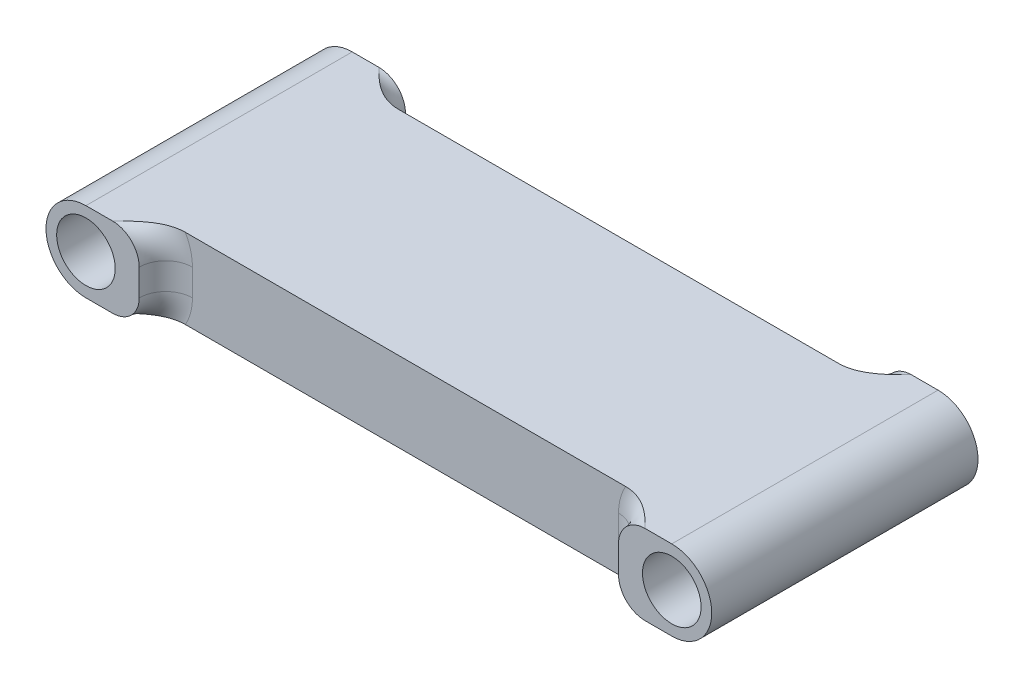
ISO-10303-21;
HEADER;
FILE_DESCRIPTION(('STEP AP214'),'2;1');
FILE_NAME('part.step','',(''),(''),'','','');
FILE_SCHEMA(('AUTOMOTIVE_DESIGN { 1 0 10303 214 1 1 1 1 }'));
ENDSEC;
DATA;
#1=APPLICATION_CONTEXT('core data for automotive mechanical design processes');
#2=APPLICATION_PROTOCOL_DEFINITION('international standard','automotive_design',2000,#1);
#3=PRODUCT_CONTEXT('',#1,'mechanical');
#4=PRODUCT('Part','Part','',(#3));
#5=PRODUCT_RELATED_PRODUCT_CATEGORY('part','',(#4));
#6=PRODUCT_DEFINITION_FORMATION('','',#4);
#7=PRODUCT_DEFINITION_CONTEXT('part definition',#1,'design');
#8=PRODUCT_DEFINITION('design','',#6,#7);
#9=PRODUCT_DEFINITION_SHAPE('','',#8);
#10=(LENGTH_UNIT() NAMED_UNIT(*) SI_UNIT(.MILLI.,.METRE.));
#11=(NAMED_UNIT(*) PLANE_ANGLE_UNIT() SI_UNIT($,.RADIAN.));
#12=(NAMED_UNIT(*) SI_UNIT($,.STERADIAN.) SOLID_ANGLE_UNIT());
#13=UNCERTAINTY_MEASURE_WITH_UNIT(LENGTH_MEASURE(1.E-05),#10,'distance_accuracy_value','');
#14=(GEOMETRIC_REPRESENTATION_CONTEXT(3) GLOBAL_UNCERTAINTY_ASSIGNED_CONTEXT((#13)) GLOBAL_UNIT_ASSIGNED_CONTEXT((#10,
#11,#12)) REPRESENTATION_CONTEXT('',''));
#15=CARTESIAN_POINT('',(0.,0.,0.));
#16=DIRECTION('',(0.,0.,1.));
#17=DIRECTION('',(1.,0.,0.));
#18=AXIS2_PLACEMENT_3D('',#15,#16,#17);
#19=CARTESIAN_POINT('',(55.,0.,25.));
#20=DIRECTION('',(0.,0.,1.));
#21=DIRECTION('',(1.,0.,0.));
#22=AXIS2_PLACEMENT_3D('',#19,#20,#21);
#23=PLANE('',#22);
#24=CARTESIAN_POINT('',(55.,0.,25.));
#25=DIRECTION('',(0.,0.,1.));
#26=DIRECTION('',(1.,0.,0.));
#27=AXIS2_PLACEMENT_3D('',#24,#25,#26);
#28=CIRCLE('',#27,5.5);
#29=CARTESIAN_POINT('',(60.5,0.,25.));
#30=VERTEX_POINT('',#29);
#31=EDGE_CURVE('E451',#30,#30,#28,.T.);
#32=ORIENTED_EDGE('',*,*,#31,.F.);
#33=EDGE_LOOP('',(#32));
#34=FACE_BOUND('',#33,.T.);
#35=DIRECTION('',(0.,1.,0.));
#36=VECTOR('',#35,1.);
#37=CARTESIAN_POINT('',(45.,-7.50000000000002,25.));
#38=LINE('',#37,#36);
#39=CARTESIAN_POINT('',(45.,-2.49999999999998,25.));
#40=VERTEX_POINT('',#39);
#41=CARTESIAN_POINT('',(45.,2.50000000000001,25.));
#42=VERTEX_POINT('',#41);
#43=EDGE_CURVE('E432',#40,#42,#38,.T.);
#44=ORIENTED_EDGE('',*,*,#43,.F.);
#45=CARTESIAN_POINT('',(50.,-2.49999999999998,25.));
#46=DIRECTION('',(0.,0.,1.));
#47=DIRECTION('',(1.,0.,0.));
#48=AXIS2_PLACEMENT_3D('',#45,#46,#47);
#49=CIRCLE('',#48,5.);
#50=CARTESIAN_POINT('',(50.,-7.49999999999998,25.));
#51=VERTEX_POINT('',#50);
#52=EDGE_CURVE('E236',#40,#51,#49,.T.);
#53=ORIENTED_EDGE('',*,*,#52,.T.);
#54=DIRECTION('',(1.,0.,0.));
#55=VECTOR('',#54,1.);
#56=CARTESIAN_POINT('',(55.,-7.49999999999998,25.));
#57=LINE('',#56,#55);
#58=CARTESIAN_POINT('',(55.,-7.49999999999998,25.));
#59=VERTEX_POINT('',#58);
#60=EDGE_CURVE('E202',#51,#59,#57,.T.);
#61=ORIENTED_EDGE('',*,*,#60,.T.);
#62=CARTESIAN_POINT('',(55.,0.,25.));
#63=DIRECTION('',(0.,0.,1.));
#64=DIRECTION('',(1.,0.,0.));
#65=AXIS2_PLACEMENT_3D('',#62,#63,#64);
#66=CIRCLE('',#65,7.5);
#67=CARTESIAN_POINT('',(55.,7.50000000000002,25.));
#68=VERTEX_POINT('',#67);
#69=EDGE_CURVE('E200',#59,#68,#66,.T.);
#70=ORIENTED_EDGE('',*,*,#69,.T.);
#71=DIRECTION('',(-1.,0.,0.));
#72=VECTOR('',#71,1.);
#73=CARTESIAN_POINT('',(55.,7.50000000000002,25.));
#74=LINE('',#73,#72);
#75=CARTESIAN_POINT('',(50.,7.50000000000002,25.));
#76=VERTEX_POINT('',#75);
#77=EDGE_CURVE('E183',#68,#76,#74,.T.);
#78=ORIENTED_EDGE('',*,*,#77,.T.);
#79=CARTESIAN_POINT('',(50.,2.50000000000002,25.));
#80=DIRECTION('',(0.,0.,1.));
#81=DIRECTION('',(1.,0.,0.));
#82=AXIS2_PLACEMENT_3D('',#79,#80,#81);
#83=CIRCLE('',#82,5.);
#84=EDGE_CURVE('E233',#76,#42,#83,.T.);
#85=ORIENTED_EDGE('',*,*,#84,.T.);
#86=EDGE_LOOP('',(#44,#53,#61,#70,#78,#85));
#87=FACE_BOUND('',#86,.T.);
#88=ADVANCED_FACE('F43',(#34,#87),#23,.T.);
#89=CARTESIAN_POINT('',(55.,0.,-25.));
#90=DIRECTION('',(0.,0.,1.));
#91=DIRECTION('',(1.,0.,0.));
#92=AXIS2_PLACEMENT_3D('',#89,#90,#91);
#93=PLANE('',#92);
#94=CARTESIAN_POINT('',(55.,0.,-25.));
#95=DIRECTION('',(0.,0.,1.));
#96=DIRECTION('',(1.,0.,0.));
#97=AXIS2_PLACEMENT_3D('',#94,#95,#96);
#98=CIRCLE('',#97,5.5);
#99=CARTESIAN_POINT('',(60.5,0.,-25.));
#100=VERTEX_POINT('',#99);
#101=EDGE_CURVE('E450',#100,#100,#98,.T.);
#102=ORIENTED_EDGE('',*,*,#101,.T.);
#103=EDGE_LOOP('',(#102));
#104=FACE_BOUND('',#103,.T.);
#105=DIRECTION('',(1.,0.,0.));
#106=VECTOR('',#105,1.);
#107=CARTESIAN_POINT('',(55.,-7.49999999999998,-25.));
#108=LINE('',#107,#106);
#109=CARTESIAN_POINT('',(50.,-7.49999999999998,-25.));
#110=VERTEX_POINT('',#109);
#111=CARTESIAN_POINT('',(55.,-7.49999999999998,-25.));
#112=VERTEX_POINT('',#111);
#113=EDGE_CURVE('E483',#110,#112,#108,.T.);
#114=ORIENTED_EDGE('',*,*,#113,.F.);
#115=CARTESIAN_POINT('',(50.,-2.49999999999998,-25.));
#116=DIRECTION('',(0.,0.,1.));
#117=DIRECTION('',(1.,0.,0.));
#118=AXIS2_PLACEMENT_3D('',#115,#116,#117);
#119=CIRCLE('',#118,5.);
#120=CARTESIAN_POINT('',(45.,-2.49999999999998,-25.));
#121=VERTEX_POINT('',#120);
#122=EDGE_CURVE('E248',#110,#121,#119,.F.);
#123=ORIENTED_EDGE('',*,*,#122,.T.);
#124=DIRECTION('',(0.,1.,0.));
#125=VECTOR('',#124,1.);
#126=CARTESIAN_POINT('',(45.,-7.50000000000002,-25.));
#127=LINE('',#126,#125);
#128=CARTESIAN_POINT('',(45.,2.50000000000001,-25.));
#129=VERTEX_POINT('',#128);
#130=EDGE_CURVE('E517',#121,#129,#127,.T.);
#131=ORIENTED_EDGE('',*,*,#130,.T.);
#132=CARTESIAN_POINT('',(50.,2.50000000000002,-25.));
#133=DIRECTION('',(0.,0.,1.));
#134=DIRECTION('',(1.,0.,0.));
#135=AXIS2_PLACEMENT_3D('',#132,#133,#134);
#136=CIRCLE('',#135,5.);
#137=CARTESIAN_POINT('',(50.,7.50000000000002,-25.));
#138=VERTEX_POINT('',#137);
#139=EDGE_CURVE('E245',#129,#138,#136,.F.);
#140=ORIENTED_EDGE('',*,*,#139,.T.);
#141=DIRECTION('',(-1.,0.,0.));
#142=VECTOR('',#141,1.);
#143=CARTESIAN_POINT('',(55.,7.50000000000002,-25.));
#144=LINE('',#143,#142);
#145=CARTESIAN_POINT('',(55.,7.50000000000002,-25.));
#146=VERTEX_POINT('',#145);
#147=EDGE_CURVE('E476',#146,#138,#144,.T.);
#148=ORIENTED_EDGE('',*,*,#147,.F.);
#149=CARTESIAN_POINT('',(55.,0.,-25.));
#150=DIRECTION('',(0.,0.,1.));
#151=DIRECTION('',(1.,0.,0.));
#152=AXIS2_PLACEMENT_3D('',#149,#150,#151);
#153=CIRCLE('',#152,7.5);
#154=EDGE_CURVE('E212',#112,#146,#153,.T.);
#155=ORIENTED_EDGE('',*,*,#154,.F.);
#156=EDGE_LOOP('',(#114,#123,#131,#140,#148,#155));
#157=FACE_BOUND('',#156,.T.);
#158=ADVANCED_FACE('F559',(#104,#157),#93,.F.);
#159=CARTESIAN_POINT('',(-55.,0.,-25.));
#160=DIRECTION('',(0.,0.,1.));
#161=DIRECTION('',(1.,0.,0.));
#162=AXIS2_PLACEMENT_3D('',#159,#160,#161);
#163=CIRCLE('',#162,5.5);
#164=CARTESIAN_POINT('',(-49.5,0.,-25.));
#165=VERTEX_POINT('',#164);
#166=EDGE_CURVE('E455',#165,#165,#163,.T.);
#167=ORIENTED_EDGE('',*,*,#166,.T.);
#168=EDGE_LOOP('',(#167));
#169=FACE_BOUND('',#168,.T.);
#170=CARTESIAN_POINT('',(-50.,7.49999999999999,-25.));
#171=VERTEX_POINT('',#170);
#172=CARTESIAN_POINT('',(-55.,7.49999999999999,-25.));
#173=VERTEX_POINT('',#172);
#174=EDGE_CURVE('E475',#171,#173,#144,.T.);
#175=ORIENTED_EDGE('',*,*,#174,.F.);
#176=CARTESIAN_POINT('',(-50.,2.49999999999999,-25.));
#177=DIRECTION('',(0.,0.,1.));
#178=DIRECTION('',(1.,0.,0.));
#179=AXIS2_PLACEMENT_3D('',#176,#177,#178);
#180=CIRCLE('',#179,5.);
#181=CARTESIAN_POINT('',(-45.,2.49999999999999,-25.));
#182=VERTEX_POINT('',#181);
#183=EDGE_CURVE('E254',#171,#182,#180,.F.);
#184=ORIENTED_EDGE('',*,*,#183,.T.);
#185=DIRECTION('',(0.,1.,0.));
#186=VECTOR('',#185,1.);
#187=CARTESIAN_POINT('',(-45.,-7.50000000000004,-25.));
#188=LINE('',#187,#186);
#189=CARTESIAN_POINT('',(-45.,-2.50000000000001,-25.));
#190=VERTEX_POINT('',#189);
#191=EDGE_CURVE('E504',#190,#182,#188,.T.);
#192=ORIENTED_EDGE('',*,*,#191,.F.);
#193=CARTESIAN_POINT('',(-50.,-2.50000000000001,-25.));
#194=DIRECTION('',(0.,0.,1.));
#195=DIRECTION('',(1.,0.,0.));
#196=AXIS2_PLACEMENT_3D('',#193,#194,#195);
#197=CIRCLE('',#196,5.);
#198=CARTESIAN_POINT('',(-50.,-7.50000000000001,-25.));
#199=VERTEX_POINT('',#198);
#200=EDGE_CURVE('E251',#190,#199,#197,.F.);
#201=ORIENTED_EDGE('',*,*,#200,.T.);
#202=CARTESIAN_POINT('',(-55.,-7.50000000000001,-25.));
#203=VERTEX_POINT('',#202);
#204=EDGE_CURVE('E207',#203,#199,#108,.T.);
#205=ORIENTED_EDGE('',*,*,#204,.F.);
#206=CARTESIAN_POINT('',(-55.,0.,-25.));
#207=DIRECTION('',(0.,0.,1.));
#208=DIRECTION('',(1.,0.,0.));
#209=AXIS2_PLACEMENT_3D('',#206,#207,#208);
#210=CIRCLE('',#209,7.5);
#211=EDGE_CURVE('E479',#173,#203,#210,.T.);
#212=ORIENTED_EDGE('',*,*,#211,.F.);
#213=EDGE_LOOP('',(#175,#184,#192,#201,#205,#212));
#214=FACE_BOUND('',#213,.T.);
#215=ADVANCED_FACE('F501',(#169,#214),#93,.F.);
#216=CARTESIAN_POINT('',(55.,7.50000000000002,25.));
#217=DIRECTION('',(0.,-1.,0.));
#218=DIRECTION('',(1.,0.,0.));
#219=AXIS2_PLACEMENT_3D('',#216,#217,#218);
#220=PLANE('',#219);
#221=CARTESIAN_POINT('',(-50.,7.49999999999999,25.));
#222=VERTEX_POINT('',#221);
#223=CARTESIAN_POINT('',(-55.,7.49999999999999,25.));
#224=VERTEX_POINT('',#223);
#225=EDGE_CURVE('E197',#222,#224,#74,.T.);
#226=ORIENTED_EDGE('',*,*,#225,.F.);
#227=CARTESIAN_POINT('',(-41.3397459621556,7.5,20.));
#228=CARTESIAN_POINT('',(-41.5539842692324,7.5,19.9999703034739));
#229=CARTESIAN_POINT('',(-41.768097465597,7.49999999999999,20.0103223198115));
#230=CARTESIAN_POINT('',(-42.1941977522546,7.49999999999999,20.050367720903));
#231=CARTESIAN_POINT('',(-42.4061875803566,7.49999999999999,20.0800316721569));
#232=CARTESIAN_POINT('',(-42.8242924364531,7.49999999999999,20.1568219385643));
#233=CARTESIAN_POINT('',(-43.03044747217,7.49999999999999,20.2037335763176));
#234=CARTESIAN_POINT('',(-43.4385029560438,7.49999999999999,20.3135973669761));
#235=CARTESIAN_POINT('',(-43.6404013218539,7.49999999999999,20.3765571821013));
#236=CARTESIAN_POINT('',(-44.1132359176737,7.49999999999999,20.5431403705869));
#237=CARTESIAN_POINT('',(-44.3819191639897,7.49999999999999,20.6531782939246));
#238=CARTESIAN_POINT('',(-44.9084009542293,7.49999999999999,20.8966864157497));
#239=CARTESIAN_POINT('',(-45.1661961696543,7.49999999999999,21.0301637163094));
#240=CARTESIAN_POINT('',(-45.6717553078735,7.49999999999999,21.3174239745699));
#241=CARTESIAN_POINT('',(-45.9194654505235,7.49999999999999,21.4713008527283));
#242=CARTESIAN_POINT('',(-46.4040882068455,7.49999999999999,21.7953125127805));
#243=CARTESIAN_POINT('',(-46.6409958114063,7.49999999999999,21.9654547258867));
#244=CARTESIAN_POINT('',(-47.4334968335473,7.49999999999999,22.5687077761884));
#245=CARTESIAN_POINT('',(-47.9651805169322,7.49999999999999,23.032940684198));
#246=CARTESIAN_POINT('',(-48.9945791026282,7.49999999999999,23.9947603934727));
#247=CARTESIAN_POINT('',(-49.4923199370093,7.49999999999999,24.4923211431129));
#248=CARTESIAN_POINT('',(-49.9933333310541,7.49999999999999,24.9933333330424));
#249=CARTESIAN_POINT('',(-49.9966666643816,7.49999999999999,24.9966666663836));
#250=CARTESIAN_POINT('',(-50.,7.49999999999999,25.));
#251=B_SPLINE_CURVE_WITH_KNOTS('',3,(#227,#228,#229,#230,#231,#232,#233,#234,#235,#236,#237,
#238,#239,#240,#241,#242,#243,#244,#245,#246,#247,#248,#249,#250),.UNSPECIFIED.,.F.,.F.,(4,2,2,
2,2,2,2,2,2,2,2,4),(0.,0.642281703378409,1.28358678373059,1.91716595005307,2.55104818793522,
3.42069998684846,4.29061574416331,5.16468554626506,6.03915661439453,8.15226547096974,
10.2637414108498,10.2778835464735),.UNSPECIFIED.);
#252=CARTESIAN_POINT('',(-41.3397459621556,7.49999999999999,20.));
#253=VERTEX_POINT('',#252);
#254=EDGE_CURVE('E379',#222,#253,#251,.F.);
#255=ORIENTED_EDGE('',*,*,#254,.T.);
#256=DIRECTION('',(1.,0.,0.));
#257=VECTOR('',#256,1.);
#258=CARTESIAN_POINT('',(55.,7.50000000000002,20.));
#259=LINE('',#258,#257);
#260=CARTESIAN_POINT('',(41.3397459621556,7.50000000000002,20.));
#261=VERTEX_POINT('',#260);
#262=EDGE_CURVE('E232',#253,#261,#259,.T.);
#263=ORIENTED_EDGE('',*,*,#262,.T.);
#264=CARTESIAN_POINT('',(41.3397459621556,7.50000000000002,20.));
#265=CARTESIAN_POINT('',(41.5539842692325,7.50000000000002,19.9999703034739));
#266=CARTESIAN_POINT('',(41.7680974655974,7.50000000000002,20.0103223198115));
#267=CARTESIAN_POINT('',(42.1941977522552,7.50000000000002,20.0503677209031));
#268=CARTESIAN_POINT('',(42.4061875803574,7.50000000000002,20.080031672157));
#269=CARTESIAN_POINT('',(42.8242924364538,7.50000000000002,20.1568219385644));
#270=CARTESIAN_POINT('',(43.0304474721706,7.50000000000002,20.2037335763178));
#271=CARTESIAN_POINT('',(43.4385029560442,7.50000000000002,20.3135973669762));
#272=CARTESIAN_POINT('',(43.6404013218541,7.50000000000002,20.3765571821013));
#273=CARTESIAN_POINT('',(44.1132359176736,7.50000000000002,20.5431403705868));
#274=CARTESIAN_POINT('',(44.3819191639895,7.50000000000002,20.6531782939245));
#275=CARTESIAN_POINT('',(44.9084009542289,7.50000000000002,20.8966864157495));
#276=CARTESIAN_POINT('',(45.1661961696538,7.50000000000002,21.0301637163091));
#277=CARTESIAN_POINT('',(45.671755307873,7.50000000000002,21.3174239745696));
#278=CARTESIAN_POINT('',(45.9194654505231,7.50000000000002,21.4713008527281));
#279=CARTESIAN_POINT('',(46.4040882068454,7.50000000000002,21.7953125127803));
#280=CARTESIAN_POINT('',(46.6409958114064,7.50000000000002,21.9654547258865));
#281=CARTESIAN_POINT('',(47.433496833547,7.50000000000002,22.5687077761889));
#282=CARTESIAN_POINT('',(47.9651805169302,7.50000000000002,23.0329406842003));
#283=CARTESIAN_POINT('',(48.9945791026305,7.50000000000002,23.9947603934707));
#284=CARTESIAN_POINT('',(49.4923199370178,7.50000000000002,24.4923211431047));
#285=CARTESIAN_POINT('',(49.9933333310543,7.50000000000002,24.9933333330423));
#286=CARTESIAN_POINT('',(49.9966666643817,7.50000000000002,24.9966666663835));
#287=CARTESIAN_POINT('',(50.,7.50000000000002,25.));
#288=B_SPLINE_CURVE_WITH_KNOTS('',3,(#264,#265,#266,#267,#268,#269,#270,#271,#272,#273,#274,
#275,#276,#277,#278,#279,#280,#281,#282,#283,#284,#285,#286,#287),.UNSPECIFIED.,.F.,.F.,(4,2,2,
2,2,2,2,2,2,2,2,4),(0.,0.642281703378847,1.28358678373148,1.91716595005353,2.55104818793522,
3.42069998684809,4.29061574416262,5.16468554626477,6.03915661439455,8.15226547097013,
10.2637414108498,10.2778835464735),.UNSPECIFIED.);
#289=EDGE_CURVE('E11',#261,#76,#288,.T.);
#290=ORIENTED_EDGE('',*,*,#289,.T.);
#291=ORIENTED_EDGE('',*,*,#77,.F.);
#292=DIRECTION('',(0.,0.,-1.));
#293=VECTOR('',#292,1.);
#294=CARTESIAN_POINT('',(55.,7.50000000000002,25.));
#295=LINE('',#294,#293);
#296=EDGE_CURVE('E189',#68,#146,#295,.T.);
#297=ORIENTED_EDGE('',*,*,#296,.T.);
#298=ORIENTED_EDGE('',*,*,#147,.T.);
#299=CARTESIAN_POINT('',(41.3397459621556,7.50000000000002,-20.));
#300=CARTESIAN_POINT('',(41.5539842692325,7.50000000000002,-19.9999703034739));
#301=CARTESIAN_POINT('',(41.7680974655973,7.50000000000002,-20.0103223198115));
#302=CARTESIAN_POINT('',(42.1941977522551,7.50000000000002,-20.0503677209031));
#303=CARTESIAN_POINT('',(42.4061875803573,7.50000000000002,-20.080031672157));
#304=CARTESIAN_POINT('',(42.8242924364537,7.50000000000002,-20.1568219385644));
#305=CARTESIAN_POINT('',(43.0304474721705,7.50000000000002,-20.2037335763178));
#306=CARTESIAN_POINT('',(43.4385029560441,7.50000000000002,-20.3135973669762));
#307=CARTESIAN_POINT('',(43.640401321854,7.50000000000002,-20.3765571821014));
#308=CARTESIAN_POINT('',(44.1132359176736,7.50000000000002,-20.5431403705869));
#309=CARTESIAN_POINT('',(44.3819191639895,7.50000000000002,-20.6531782939245));
#310=CARTESIAN_POINT('',(44.9084009542289,7.50000000000002,-20.8966864157495));
#311=CARTESIAN_POINT('',(45.1661961696539,7.50000000000002,-21.0301637163092));
#312=CARTESIAN_POINT('',(45.6717553078731,7.50000000000002,-21.3174239745697));
#313=CARTESIAN_POINT('',(45.9194654505232,7.50000000000002,-21.4713008527282));
#314=CARTESIAN_POINT('',(46.4040882068454,7.50000000000002,-21.7953125127804));
#315=CARTESIAN_POINT('',(46.6409958114064,7.50000000000002,-21.9654547258866));
#316=CARTESIAN_POINT('',(47.4334968335471,7.50000000000002,-22.5687077761888));
#317=CARTESIAN_POINT('',(47.9651805169305,7.50000000000002,-23.0329406842));
#318=CARTESIAN_POINT('',(48.9945791026302,7.50000000000002,-23.994760393471));
#319=CARTESIAN_POINT('',(49.4923199370166,7.50000000000002,-24.4923211431059));
#320=CARTESIAN_POINT('',(49.9933333310543,7.50000000000002,-24.9933333330423));
#321=CARTESIAN_POINT('',(49.9966666643817,7.50000000000002,-24.9966666663836));
#322=CARTESIAN_POINT('',(50.,7.50000000000002,-25.));
#323=B_SPLINE_CURVE_WITH_KNOTS('',3,(#299,#300,#301,#302,#303,#304,#305,#306,#307,#308,#309,
#310,#311,#312,#313,#314,#315,#316,#317,#318,#319,#320,#321,#322),.UNSPECIFIED.,.F.,.F.,(4,2,2,
2,2,2,2,2,2,2,2,4),(0.,0.642281703378785,1.28358678373135,1.91716595005346,2.55104818793522,
3.42069998684815,4.29061574416273,5.16468554626482,6.03915661439454,8.15226547097009,
10.2637414108498,10.2778835464735),.UNSPECIFIED.);
#324=CARTESIAN_POINT('',(41.3397459621556,7.50000000000002,-20.));
#325=VERTEX_POINT('',#324);
#326=EDGE_CURVE('E303',#138,#325,#323,.F.);
#327=ORIENTED_EDGE('',*,*,#326,.T.);
#328=DIRECTION('',(1.,0.,0.));
#329=VECTOR('',#328,1.);
#330=CARTESIAN_POINT('',(55.,7.50000000000002,-20.));
#331=LINE('',#330,#329);
#332=CARTESIAN_POINT('',(-41.3397459621556,7.49999999999999,-20.));
#333=VERTEX_POINT('',#332);
#334=EDGE_CURVE('E437',#333,#325,#331,.T.);
#335=ORIENTED_EDGE('',*,*,#334,.F.);
#336=CARTESIAN_POINT('',(-41.3397459621556,7.5,-20.));
#337=CARTESIAN_POINT('',(-41.5539842692328,7.5,-19.9999703034739));
#338=CARTESIAN_POINT('',(-41.7680974655979,7.49999999999999,-20.0103223198115));
#339=CARTESIAN_POINT('',(-42.1941977522564,7.49999999999999,-20.0503677209032));
#340=CARTESIAN_POINT('',(-42.4061875803588,7.49999999999999,-20.0800316721572));
#341=CARTESIAN_POINT('',(-42.8242924364552,7.49999999999999,-20.1568219385647));
#342=CARTESIAN_POINT('',(-43.0304474721717,7.49999999999999,-20.2037335763181));
#343=CARTESIAN_POINT('',(-43.4385029560447,7.49999999999999,-20.3135973669764));
#344=CARTESIAN_POINT('',(-43.6404013218543,7.49999999999999,-20.3765571821014));
#345=CARTESIAN_POINT('',(-44.1132359176733,7.49999999999999,-20.5431403705868));
#346=CARTESIAN_POINT('',(-44.381919163989,7.49999999999999,-20.6531782939243));
#347=CARTESIAN_POINT('',(-44.908400954228,7.49999999999999,-20.8966864157491));
#348=CARTESIAN_POINT('',(-45.1661961696528,7.49999999999999,-21.0301637163086));
#349=CARTESIAN_POINT('',(-45.671755307872,7.49999999999999,-21.317423974569));
#350=CARTESIAN_POINT('',(-45.9194654505223,7.49999999999999,-21.4713008527277));
#351=CARTESIAN_POINT('',(-46.4040882068451,7.49999999999999,-21.79531251278));
#352=CARTESIAN_POINT('',(-46.6409958114065,7.49999999999999,-21.9654547258861));
#353=CARTESIAN_POINT('',(-47.4334968335465,7.49999999999999,-22.5687077761897));
#354=CARTESIAN_POINT('',(-47.9651805169262,7.49999999999998,-23.032940684205));
#355=CARTESIAN_POINT('',(-48.9945791026352,7.5,-23.9947603934667));
#356=CARTESIAN_POINT('',(-49.4923199370346,7.50000000000003,-24.4923211430882));
#357=CARTESIAN_POINT('',(-49.9933333310545,7.49999999999999,-24.9933333330421));
#358=CARTESIAN_POINT('',(-49.9966666643818,7.49999999999999,-24.9966666663834));
#359=CARTESIAN_POINT('',(-50.,7.49999999999999,-25.));
#360=B_SPLINE_CURVE_WITH_KNOTS('',3,(#336,#337,#338,#339,#340,#341,#342,#343,#344,#345,#346,
#347,#348,#349,#350,#351,#352,#353,#354,#355,#356,#357,#358,#359),.UNSPECIFIED.,.F.,.F.,(4,2,2,
2,2,2,2,2,2,2,2,4),(0.,0.642281703379697,1.28358678373324,1.91716595005442,2.55104818793522,
3.42069998684735,4.29061574416124,5.16468554626419,6.03915661439455,8.15226547097088,
10.2637414108497,10.2778835464735),.UNSPECIFIED.);
#361=EDGE_CURVE('E346',#333,#171,#360,.T.);
#362=ORIENTED_EDGE('',*,*,#361,.T.);
#363=ORIENTED_EDGE('',*,*,#174,.T.);
#364=DIRECTION('',(0.,0.,-1.));
#365=VECTOR('',#364,1.);
#366=CARTESIAN_POINT('',(-55.,7.49999999999999,25.));
#367=LINE('',#366,#365);
#368=EDGE_CURVE('E215',#224,#173,#367,.T.);
#369=ORIENTED_EDGE('',*,*,#368,.F.);
#370=EDGE_LOOP('',(#226,#255,#263,#290,#291,#297,#298,#327,#335,#362,#363,#369));
#371=FACE_BOUND('',#370,.T.);
#372=ADVANCED_FACE('F186',(#371),#220,.F.);
#373=CARTESIAN_POINT('',(55.,-7.49999999999998,25.));
#374=DIRECTION('',(0.,1.,0.));
#375=DIRECTION('',(-1.,0.,0.));
#376=AXIS2_PLACEMENT_3D('',#373,#374,#375);
#377=PLANE('',#376);
#378=ORIENTED_EDGE('',*,*,#60,.F.);
#379=CARTESIAN_POINT('',(41.3397459621557,-7.50000000000002,20.));
#380=CARTESIAN_POINT('',(41.5539842692325,-7.5,19.9999703034739));
#381=CARTESIAN_POINT('',(41.7680974655972,-7.49999999999999,20.0103223198115));
#382=CARTESIAN_POINT('',(42.1941977522549,-7.49999999999998,20.0503677209031));
#383=CARTESIAN_POINT('',(42.406187580357,-7.49999999999998,20.080031672157));
#384=CARTESIAN_POINT('',(42.8242924364534,-7.49999999999998,20.1568219385643));
#385=CARTESIAN_POINT('',(43.0304474721703,-7.49999999999998,20.2037335763177));
#386=CARTESIAN_POINT('',(43.438502956044,-7.49999999999998,20.3135973669762));
#387=CARTESIAN_POINT('',(43.640401321854,-7.49999999999998,20.3765571821013));
#388=CARTESIAN_POINT('',(44.1132359176737,-7.49999999999998,20.5431403705869));
#389=CARTESIAN_POINT('',(44.3819191639896,-7.49999999999998,20.6531782939245));
#390=CARTESIAN_POINT('',(44.9084009542292,-7.49999999999998,20.8966864157496));
#391=CARTESIAN_POINT('',(45.1661961696541,-7.49999999999998,21.0301637163093));
#392=CARTESIAN_POINT('',(45.6717553078733,-7.49999999999998,21.3174239745698));
#393=CARTESIAN_POINT('',(45.9194654505233,-7.49999999999998,21.4713008527282));
#394=CARTESIAN_POINT('',(46.4040882068455,-7.49999999999998,21.7953125127804));
#395=CARTESIAN_POINT('',(46.6409958114064,-7.49999999999998,21.9654547258867));
#396=CARTESIAN_POINT('',(47.4334968335472,-7.49999999999998,22.5687077761886));
#397=CARTESIAN_POINT('',(47.9651805169314,-7.49999999999998,23.032940684199));
#398=CARTESIAN_POINT('',(48.9945791026292,-7.49999999999998,23.9947603934718));
#399=CARTESIAN_POINT('',(49.4923199370131,-7.49999999999998,24.4923211431093));
#400=CARTESIAN_POINT('',(49.9933333310542,-7.49999999999998,24.9933333330423));
#401=CARTESIAN_POINT('',(49.9966666643817,-7.49999999999998,24.9966666663836));
#402=CARTESIAN_POINT('',(50.,-7.49999999999998,25.));
#403=B_SPLINE_CURVE_WITH_KNOTS('',3,(#379,#380,#381,#382,#383,#384,#385,#386,#387,#388,#389,
#390,#391,#392,#393,#394,#395,#396,#397,#398,#399,#400,#401,#402),.UNSPECIFIED.,.F.,.F.,(4,2,2,
2,2,2,2,2,2,2,2,4),(0.,0.642281703378597,1.28358678373098,1.91716595005326,2.55104818793522,
3.42069998684831,4.29061574416301,5.16468554626494,6.03915661439455,8.15226547096992,
10.2637414108497,10.2778835464735),.UNSPECIFIED.);
#404=CARTESIAN_POINT('',(41.3397459621557,-7.50000000000002,20.));
#405=VERTEX_POINT('',#404);
#406=EDGE_CURVE('E54',#51,#405,#403,.F.);
#407=ORIENTED_EDGE('',*,*,#406,.T.);
#408=DIRECTION('',(-1.,0.,0.));
#409=VECTOR('',#408,1.);
#410=CARTESIAN_POINT('',(0.,-7.50000000000003,20.));
#411=LINE('',#410,#409);
#412=CARTESIAN_POINT('',(-41.3397459621556,-7.50000000000004,20.));
#413=VERTEX_POINT('',#412);
#414=EDGE_CURVE('E525',#405,#413,#411,.T.);
#415=ORIENTED_EDGE('',*,*,#414,.T.);
#416=CARTESIAN_POINT('',(-41.3397459621556,-7.50000000000005,20.));
#417=CARTESIAN_POINT('',(-41.5539842692326,-7.50000000000002,19.9999703034739));
#418=CARTESIAN_POINT('',(-41.7680974655974,-7.50000000000001,20.0103223198115));
#419=CARTESIAN_POINT('',(-42.1941977522554,-7.50000000000001,20.0503677209031));
#420=CARTESIAN_POINT('',(-42.4061875803576,-7.50000000000001,20.0800316721571));
#421=CARTESIAN_POINT('',(-42.8242924364541,-7.50000000000001,20.1568219385645));
#422=CARTESIAN_POINT('',(-43.0304474721708,-7.50000000000001,20.2037335763178));
#423=CARTESIAN_POINT('',(-43.4385029560443,-7.50000000000001,20.3135973669763));
#424=CARTESIAN_POINT('',(-43.6404013218541,-7.50000000000001,20.3765571821014));
#425=CARTESIAN_POINT('',(-44.1132359176735,-7.50000000000001,20.5431403705868));
#426=CARTESIAN_POINT('',(-44.3819191639894,-7.50000000000001,20.6531782939245));
#427=CARTESIAN_POINT('',(-44.9084009542287,-7.50000000000001,20.8966864157494));
#428=CARTESIAN_POINT('',(-45.1661961696536,-7.50000000000001,21.030163716309));
#429=CARTESIAN_POINT('',(-45.6717553078728,-7.50000000000001,21.3174239745695));
#430=CARTESIAN_POINT('',(-45.9194654505229,-7.50000000000001,21.4713008527281));
#431=CARTESIAN_POINT('',(-46.4040882068453,-7.50000000000001,21.7953125127803));
#432=CARTESIAN_POINT('',(-46.6409958114064,-7.50000000000001,21.9654547258865));
#433=CARTESIAN_POINT('',(-47.4334968335469,-7.50000000000001,22.5687077761891));
#434=CARTESIAN_POINT('',(-47.9651805169294,-7.50000000000001,23.0329406842013));
#435=CARTESIAN_POINT('',(-48.9945791026314,-7.50000000000001,23.9947603934699));
#436=CARTESIAN_POINT('',(-49.4923199370211,-7.50000000000001,24.4923211431014));
#437=CARTESIAN_POINT('',(-49.9933333310543,-7.50000000000001,24.9933333330422));
#438=CARTESIAN_POINT('',(-49.9966666643817,-7.50000000000001,24.9966666663835));
#439=CARTESIAN_POINT('',(-50.,-7.50000000000001,25.));
#440=B_SPLINE_CURVE_WITH_KNOTS('',3,(#416,#417,#418,#419,#420,#421,#422,#423,#424,#425,#426,
#427,#428,#429,#430,#431,#432,#433,#434,#435,#436,#437,#438,#439),.UNSPECIFIED.,.F.,.F.,(4,2,2,
2,2,2,2,2,2,2,2,4),(0.,0.642281703379007,1.28358678373183,1.9171659500537,2.55104818793522,
3.42069998684795,4.29061574416235,5.16468554626465,6.03915661439455,8.15226547097027,
10.2637414108497,10.2778835464735),.UNSPECIFIED.);
#441=CARTESIAN_POINT('',(-50.,-7.50000000000001,25.));
#442=VERTEX_POINT('',#441);
#443=EDGE_CURVE('E353',#413,#442,#440,.T.);
#444=ORIENTED_EDGE('',*,*,#443,.T.);
#445=CARTESIAN_POINT('',(-55.,-7.50000000000001,25.));
#446=VERTEX_POINT('',#445);
#447=EDGE_CURVE('E468',#446,#442,#57,.T.);
#448=ORIENTED_EDGE('',*,*,#447,.F.);
#449=DIRECTION('',(0.,0.,-1.));
#450=VECTOR('',#449,1.);
#451=CARTESIAN_POINT('',(-55.,-7.50000000000001,25.));
#452=LINE('',#451,#450);
#453=EDGE_CURVE('E223',#446,#203,#452,.T.);
#454=ORIENTED_EDGE('',*,*,#453,.T.);
#455=ORIENTED_EDGE('',*,*,#204,.T.);
#456=CARTESIAN_POINT('',(-41.3397459621556,-7.50000000000005,-20.));
#457=CARTESIAN_POINT('',(-41.5539842692323,-7.50000000000002,-19.9999703034739));
#458=CARTESIAN_POINT('',(-41.7680974655969,-7.50000000000001,-20.0103223198115));
#459=CARTESIAN_POINT('',(-42.1941977522544,-7.50000000000001,-20.050367720903));
#460=CARTESIAN_POINT('',(-42.4061875803564,-7.50000000000001,-20.0800316721569));
#461=CARTESIAN_POINT('',(-42.8242924364528,-7.50000000000001,-20.1568219385642));
#462=CARTESIAN_POINT('',(-43.0304474721698,-7.50000000000001,-20.2037335763176));
#463=CARTESIAN_POINT('',(-43.4385029560438,-7.50000000000001,-20.3135973669761));
#464=CARTESIAN_POINT('',(-43.6404013218539,-7.50000000000001,-20.3765571821013));
#465=CARTESIAN_POINT('',(-44.1132359176737,-7.50000000000001,-20.5431403705869));
#466=CARTESIAN_POINT('',(-44.3819191639898,-7.50000000000001,-20.6531782939246));
#467=CARTESIAN_POINT('',(-44.9084009542294,-7.50000000000001,-20.8966864157498));
#468=CARTESIAN_POINT('',(-45.1661961696545,-7.50000000000001,-21.0301637163095));
#469=CARTESIAN_POINT('',(-45.6717553078737,-7.50000000000001,-21.31742397457));
#470=CARTESIAN_POINT('',(-45.9194654505236,-7.50000000000001,-21.4713008527284));
#471=CARTESIAN_POINT('',(-46.4040882068455,-7.50000000000001,-21.7953125127806));
#472=CARTESIAN_POINT('',(-46.6409958114063,-7.50000000000001,-21.9654547258868));
#473=CARTESIAN_POINT('',(-47.4334968335474,-7.50000000000001,-22.5687077761883));
#474=CARTESIAN_POINT('',(-47.9651805169329,-7.50000000000001,-23.0329406841972));
#475=CARTESIAN_POINT('',(-48.9945791026274,-7.50000000000001,-23.9947603934734));
#476=CARTESIAN_POINT('',(-49.4923199370065,-7.50000000000001,-24.4923211431157));
#477=CARTESIAN_POINT('',(-49.9933333310541,-7.50000000000001,-24.9933333330425));
#478=CARTESIAN_POINT('',(-49.9966666643816,-7.50000000000001,-24.9966666663836));
#479=CARTESIAN_POINT('',(-50.,-7.50000000000001,-25.));
#480=B_SPLINE_CURVE_WITH_KNOTS('',3,(#456,#457,#458,#459,#460,#461,#462,#463,#464,#465,#466,
#467,#468,#469,#470,#471,#472,#473,#474,#475,#476,#477,#478,#479),.UNSPECIFIED.,.F.,.F.,(4,2,2,
2,2,2,2,2,2,2,2,4),(0.,0.64228170337827,1.2835867837303,1.91716595005293,2.55104818793522,
3.4206999868486,4.29061574416356,5.16468554626518,6.03915661439456,8.15226547096964,
10.2637414108498,10.2778835464735),.UNSPECIFIED.);
#481=CARTESIAN_POINT('',(-41.3397459621556,-7.50000000000004,-20.));
#482=VERTEX_POINT('',#481);
#483=EDGE_CURVE('E339',#199,#482,#480,.F.);
#484=ORIENTED_EDGE('',*,*,#483,.T.);
#485=DIRECTION('',(-1.,0.,0.));
#486=VECTOR('',#485,1.);
#487=CARTESIAN_POINT('',(0.,-7.50000000000003,-20.));
#488=LINE('',#487,#486);
#489=CARTESIAN_POINT('',(41.3397459621556,-7.50000000000002,-20.));
#490=VERTEX_POINT('',#489);
#491=EDGE_CURVE('E405',#490,#482,#488,.T.);
#492=ORIENTED_EDGE('',*,*,#491,.F.);
#493=CARTESIAN_POINT('',(41.3397459621556,-7.50000000000002,-20.));
#494=CARTESIAN_POINT('',(41.5539842692325,-7.5,-19.9999703034739));
#495=CARTESIAN_POINT('',(41.7680974655972,-7.49999999999999,-20.0103223198115));
#496=CARTESIAN_POINT('',(42.194197752255,-7.49999999999998,-20.0503677209031));
#497=CARTESIAN_POINT('',(42.406187580357,-7.49999999999998,-20.080031672157));
#498=CARTESIAN_POINT('',(42.8242924364534,-7.49999999999998,-20.1568219385644));
#499=CARTESIAN_POINT('',(43.0304474721703,-7.49999999999998,-20.2037335763177));
#500=CARTESIAN_POINT('',(43.438502956044,-7.49999999999998,-20.3135973669762));
#501=CARTESIAN_POINT('',(43.640401321854,-7.49999999999998,-20.3765571821013));
#502=CARTESIAN_POINT('',(44.1132359176737,-7.49999999999998,-20.5431403705869));
#503=CARTESIAN_POINT('',(44.3819191639896,-7.49999999999998,-20.6531782939246));
#504=CARTESIAN_POINT('',(44.9084009542291,-7.49999999999998,-20.8966864157496));
#505=CARTESIAN_POINT('',(45.1661961696541,-7.49999999999998,-21.0301637163093));
#506=CARTESIAN_POINT('',(45.6717553078733,-7.49999999999998,-21.3174239745698));
#507=CARTESIAN_POINT('',(45.9194654505233,-7.49999999999998,-21.4713008527283));
#508=CARTESIAN_POINT('',(46.4040882068455,-7.49999999999998,-21.7953125127805));
#509=CARTESIAN_POINT('',(46.6409958114064,-7.49999999999998,-21.9654547258867));
#510=CARTESIAN_POINT('',(47.4334968335472,-7.49999999999998,-22.5687077761887));
#511=CARTESIAN_POINT('',(47.9651805169313,-7.49999999999998,-23.0329406841991));
#512=CARTESIAN_POINT('',(48.9945791026293,-7.49999999999998,-23.9947603934717));
#513=CARTESIAN_POINT('',(49.4923199370134,-7.49999999999998,-24.492321143109));
#514=CARTESIAN_POINT('',(49.9933333310542,-7.49999999999998,-24.9933333330424));
#515=CARTESIAN_POINT('',(49.9966666643817,-7.49999999999998,-24.9966666663836));
#516=CARTESIAN_POINT('',(50.,-7.49999999999998,-25.));
#517=B_SPLINE_CURVE_WITH_KNOTS('',3,(#493,#494,#495,#496,#497,#498,#499,#500,#501,#502,#503,
#504,#505,#506,#507,#508,#509,#510,#511,#512,#513,#514,#515,#516),.UNSPECIFIED.,.F.,.F.,(4,2,2,
2,2,2,2,2,2,2,2,4),(0.,0.642281703378618,1.28358678373102,1.91716595005328,2.55104818793522,
3.4206999868483,4.290615744163,5.16468554626494,6.03915661439455,8.15226547096992,
10.2637414108497,10.2778835464735),.UNSPECIFIED.);
#518=EDGE_CURVE('E294',#490,#110,#517,.T.);
#519=ORIENTED_EDGE('',*,*,#518,.T.);
#520=ORIENTED_EDGE('',*,*,#113,.T.);
#521=DIRECTION('',(0.,0.,-1.));
#522=VECTOR('',#521,1.);
#523=CARTESIAN_POINT('',(55.,-7.49999999999998,25.));
#524=LINE('',#523,#522);
#525=EDGE_CURVE('E472',#59,#112,#524,.T.);
#526=ORIENTED_EDGE('',*,*,#525,.F.);
#527=EDGE_LOOP('',(#378,#407,#415,#444,#448,#454,#455,#484,#492,#519,#520,#526));
#528=FACE_BOUND('',#527,.T.);
#529=ADVANCED_FACE('F311',(#528),#377,.F.);
#530=CARTESIAN_POINT('',(-55.,0.,25.));
#531=DIRECTION('',(0.,0.,-1.));
#532=DIRECTION('',(-1.,0.,0.));
#533=AXIS2_PLACEMENT_3D('',#530,#531,#532);
#534=CYLINDRICAL_SURFACE('',#533,5.5);
#535=CARTESIAN_POINT('',(-55.,0.,25.));
#536=DIRECTION('',(0.,0.,1.));
#537=DIRECTION('',(1.,0.,0.));
#538=AXIS2_PLACEMENT_3D('',#535,#536,#537);
#539=CIRCLE('',#538,5.5);
#540=CARTESIAN_POINT('',(-49.5,0.,25.));
#541=VERTEX_POINT('',#540);
#542=EDGE_CURVE('E459',#541,#541,#539,.T.);
#543=ORIENTED_EDGE('',*,*,#542,.T.);
#544=EDGE_LOOP('',(#543));
#545=FACE_BOUND('',#544,.T.);
#546=CARTESIAN_POINT('',(-55.,0.,15.));
#547=DIRECTION('',(0.,0.,-1.));
#548=DIRECTION('',(-1.,0.,0.));
#549=AXIS2_PLACEMENT_3D('',#546,#547,#548);
#550=CIRCLE('',#549,5.5);
#551=CARTESIAN_POINT('',(-60.5,0.,15.));
#552=VERTEX_POINT('',#551);
#553=EDGE_CURVE('E231',#552,#552,#550,.T.);
#554=ORIENTED_EDGE('',*,*,#553,.T.);
#555=EDGE_LOOP('',(#554));
#556=FACE_BOUND('',#555,.T.);
#557=ADVANCED_FACE('F577',(#545,#556),#534,.F.);
#558=CARTESIAN_POINT('',(55.,0.,25.));
#559=DIRECTION('',(0.,0.,-1.));
#560=DIRECTION('',(-1.,0.,0.));
#561=AXIS2_PLACEMENT_3D('',#558,#559,#560);
#562=CYLINDRICAL_SURFACE('',#561,5.5);
#563=ORIENTED_EDGE('',*,*,#31,.T.);
#564=EDGE_LOOP('',(#563));
#565=FACE_BOUND('',#564,.T.);
#566=CARTESIAN_POINT('',(55.,0.,15.));
#567=DIRECTION('',(0.,0.,-1.));
#568=DIRECTION('',(-1.,0.,0.));
#569=AXIS2_PLACEMENT_3D('',#566,#567,#568);
#570=CIRCLE('',#569,5.5);
#571=CARTESIAN_POINT('',(49.5,0.,15.));
#572=VERTEX_POINT('',#571);
#573=EDGE_CURVE('E227',#572,#572,#570,.T.);
#574=ORIENTED_EDGE('',*,*,#573,.T.);
#575=EDGE_LOOP('',(#574));
#576=FACE_BOUND('',#575,.T.);
#577=ADVANCED_FACE('F571',(#565,#576),#562,.F.);
#578=ORIENTED_EDGE('',*,*,#447,.T.);
#579=CARTESIAN_POINT('',(-50.,-2.50000000000001,25.));
#580=DIRECTION('',(0.,0.,1.));
#581=DIRECTION('',(1.,0.,0.));
#582=AXIS2_PLACEMENT_3D('',#579,#580,#581);
#583=CIRCLE('',#582,5.);
#584=CARTESIAN_POINT('',(-45.,-2.50000000000001,25.));
#585=VERTEX_POINT('',#584);
#586=EDGE_CURVE('E242',#442,#585,#583,.T.);
#587=ORIENTED_EDGE('',*,*,#586,.T.);
#588=DIRECTION('',(0.,1.,0.));
#589=VECTOR('',#588,1.);
#590=CARTESIAN_POINT('',(-45.,-7.50000000000004,25.));
#591=LINE('',#590,#589);
#592=CARTESIAN_POINT('',(-45.,2.49999999999999,25.));
#593=VERTEX_POINT('',#592);
#594=EDGE_CURVE('E522',#585,#593,#591,.T.);
#595=ORIENTED_EDGE('',*,*,#594,.T.);
#596=CARTESIAN_POINT('',(-50.,2.49999999999999,25.));
#597=DIRECTION('',(0.,0.,1.));
#598=DIRECTION('',(1.,0.,0.));
#599=AXIS2_PLACEMENT_3D('',#596,#597,#598);
#600=CIRCLE('',#599,5.);
#601=EDGE_CURVE('E239',#593,#222,#600,.T.);
#602=ORIENTED_EDGE('',*,*,#601,.T.);
#603=ORIENTED_EDGE('',*,*,#225,.T.);
#604=CARTESIAN_POINT('',(-55.,0.,25.));
#605=DIRECTION('',(0.,0.,1.));
#606=DIRECTION('',(1.,0.,0.));
#607=AXIS2_PLACEMENT_3D('',#604,#605,#606);
#608=CIRCLE('',#607,7.5);
#609=EDGE_CURVE('E196',#224,#446,#608,.T.);
#610=ORIENTED_EDGE('',*,*,#609,.T.);
#611=EDGE_LOOP('',(#578,#587,#595,#602,#603,#610));
#612=FACE_BOUND('',#611,.T.);
#613=ORIENTED_EDGE('',*,*,#542,.F.);
#614=EDGE_LOOP('',(#613));
#615=FACE_BOUND('',#614,.T.);
#616=ADVANCED_FACE('F535',(#612,#615),#23,.T.);
#617=CARTESIAN_POINT('',(55.,0.,25.));
#618=DIRECTION('',(0.,0.,-1.));
#619=DIRECTION('',(-1.,0.,0.));
#620=AXIS2_PLACEMENT_3D('',#617,#618,#619);
#621=CYLINDRICAL_SURFACE('',#620,7.5);
#622=ORIENTED_EDGE('',*,*,#154,.T.);
#623=ORIENTED_EDGE('',*,*,#296,.F.);
#624=ORIENTED_EDGE('',*,*,#69,.F.);
#625=ORIENTED_EDGE('',*,*,#525,.T.);
#626=EDGE_LOOP('',(#622,#623,#624,#625));
#627=FACE_BOUND('',#626,.T.);
#628=ADVANCED_FACE('F210',(#627),#621,.T.);
#629=CARTESIAN_POINT('',(-55.,0.,25.));
#630=DIRECTION('',(0.,0.,-1.));
#631=DIRECTION('',(-1.,0.,0.));
#632=AXIS2_PLACEMENT_3D('',#629,#630,#631);
#633=CYLINDRICAL_SURFACE('',#632,7.5);
#634=ORIENTED_EDGE('',*,*,#211,.T.);
#635=ORIENTED_EDGE('',*,*,#453,.F.);
#636=ORIENTED_EDGE('',*,*,#609,.F.);
#637=ORIENTED_EDGE('',*,*,#368,.T.);
#638=EDGE_LOOP('',(#634,#635,#636,#637));
#639=FACE_BOUND('',#638,.T.);
#640=ADVANCED_FACE('F497',(#639),#633,.T.);
#641=CARTESIAN_POINT('',(-55.,0.,-15.));
#642=DIRECTION('',(0.,0.,-1.));
#643=DIRECTION('',(-1.,0.,0.));
#644=AXIS2_PLACEMENT_3D('',#641,#642,#643);
#645=CIRCLE('',#644,5.5);
#646=CARTESIAN_POINT('',(-60.5,0.,-15.));
#647=VERTEX_POINT('',#646);
#648=EDGE_CURVE('E220',#647,#647,#645,.T.);
#649=ORIENTED_EDGE('',*,*,#648,.F.);
#650=EDGE_LOOP('',(#649));
#651=FACE_BOUND('',#650,.T.);
#652=ORIENTED_EDGE('',*,*,#166,.F.);
#653=EDGE_LOOP('',(#652));
#654=FACE_BOUND('',#653,.T.);
#655=ADVANCED_FACE('F572',(#651,#654),#534,.F.);
#656=CARTESIAN_POINT('',(55.,0.,-15.));
#657=DIRECTION('',(0.,0.,-1.));
#658=DIRECTION('',(-1.,0.,0.));
#659=AXIS2_PLACEMENT_3D('',#656,#657,#658);
#660=CIRCLE('',#659,5.5);
#661=CARTESIAN_POINT('',(49.5,0.,-15.));
#662=VERTEX_POINT('',#661);
#663=EDGE_CURVE('E214',#662,#662,#660,.T.);
#664=ORIENTED_EDGE('',*,*,#663,.F.);
#665=EDGE_LOOP('',(#664));
#666=FACE_BOUND('',#665,.T.);
#667=ORIENTED_EDGE('',*,*,#101,.F.);
#668=EDGE_LOOP('',(#667));
#669=FACE_BOUND('',#668,.T.);
#670=ADVANCED_FACE('F575',(#666,#669),#562,.F.);
#671=CARTESIAN_POINT('',(-55.,0.,-15.));
#672=DIRECTION('',(0.,0.,-1.));
#673=DIRECTION('',(-1.,0.,0.));
#674=AXIS2_PLACEMENT_3D('',#671,#672,#673);
#675=PLANE('',#674);
#676=ORIENTED_EDGE('',*,*,#663,.T.);
#677=EDGE_LOOP('',(#676));
#678=FACE_BOUND('',#677,.T.);
#679=ADVANCED_FACE('F580',(#678),#675,.T.);
#680=CARTESIAN_POINT('',(-55.,0.,15.));
#681=DIRECTION('',(0.,0.,-1.));
#682=DIRECTION('',(-1.,0.,0.));
#683=AXIS2_PLACEMENT_3D('',#680,#681,#682);
#684=PLANE('',#683);
#685=ORIENTED_EDGE('',*,*,#573,.F.);
#686=EDGE_LOOP('',(#685));
#687=FACE_BOUND('',#686,.T.);
#688=ADVANCED_FACE('F586',(#687),#684,.F.);
#689=ORIENTED_EDGE('',*,*,#648,.T.);
#690=EDGE_LOOP('',(#689));
#691=FACE_BOUND('',#690,.T.);
#692=ADVANCED_FACE('F582',(#691),#675,.T.);
#693=ORIENTED_EDGE('',*,*,#553,.F.);
#694=EDGE_LOOP('',(#693));
#695=FACE_BOUND('',#694,.T.);
#696=ADVANCED_FACE('F585',(#695),#684,.F.);
#697=CARTESIAN_POINT('',(0.,-7.50000000000003,-20.));
#698=DIRECTION('',(0.,0.,-1.));
#699=DIRECTION('',(-1.,0.,0.));
#700=AXIS2_PLACEMENT_3D('',#697,#698,#699);
#701=PLANE('',#700);
#702=DIRECTION('',(0.,1.,0.));
#703=VECTOR('',#702,1.);
#704=CARTESIAN_POINT('',(40.,-2.49999999999999,-20.));
#705=LINE('',#704,#703);
#706=CARTESIAN_POINT('',(40.,2.50000000000002,-20.));
#707=VERTEX_POINT('',#706);
#708=CARTESIAN_POINT('',(40.,-2.49999999999999,-20.));
#709=VERTEX_POINT('',#708);
#710=EDGE_CURVE('E267',#707,#709,#705,.F.);
#711=ORIENTED_EDGE('',*,*,#710,.T.);
#712=CARTESIAN_POINT('',(50.,-2.49999999999998,-20.));
#713=DIRECTION('',(0.,0.,-1.));
#714=DIRECTION('',(-1.,0.,0.));
#715=AXIS2_PLACEMENT_3D('',#712,#713,#714);
#716=CIRCLE('',#715,10.);
#717=EDGE_CURVE('E273',#709,#490,#716,.F.);
#718=ORIENTED_EDGE('',*,*,#717,.T.);
#719=ORIENTED_EDGE('',*,*,#491,.T.);
#720=CARTESIAN_POINT('',(-50.,-2.50000000000001,-20.));
#721=DIRECTION('',(0.,0.,-1.));
#722=DIRECTION('',(-1.,0.,0.));
#723=AXIS2_PLACEMENT_3D('',#720,#721,#722);
#724=CIRCLE('',#723,10.);
#725=CARTESIAN_POINT('',(-40.,-2.50000000000001,-20.));
#726=VERTEX_POINT('',#725);
#727=EDGE_CURVE('E263',#482,#726,#724,.F.);
#728=ORIENTED_EDGE('',*,*,#727,.T.);
#729=DIRECTION('',(0.,1.,0.));
#730=VECTOR('',#729,1.);
#731=CARTESIAN_POINT('',(-40.,2.49999999999999,-20.));
#732=LINE('',#731,#730);
#733=CARTESIAN_POINT('',(-40.,2.49999999999998,-20.));
#734=VERTEX_POINT('',#733);
#735=EDGE_CURVE('E257',#726,#734,#732,.T.);
#736=ORIENTED_EDGE('',*,*,#735,.T.);
#737=CARTESIAN_POINT('',(-50.,2.49999999999999,-20.));
#738=DIRECTION('',(0.,0.,-1.));
#739=DIRECTION('',(-1.,0.,0.));
#740=AXIS2_PLACEMENT_3D('',#737,#738,#739);
#741=CIRCLE('',#740,10.);
#742=EDGE_CURVE('E260',#734,#333,#741,.F.);
#743=ORIENTED_EDGE('',*,*,#742,.T.);
#744=ORIENTED_EDGE('',*,*,#334,.T.);
#745=CARTESIAN_POINT('',(50.,2.50000000000002,-20.));
#746=DIRECTION('',(0.,0.,-1.));
#747=DIRECTION('',(-1.,0.,0.));
#748=AXIS2_PLACEMENT_3D('',#745,#746,#747);
#749=CIRCLE('',#748,10.);
#750=EDGE_CURVE('E270',#325,#707,#749,.F.);
#751=ORIENTED_EDGE('',*,*,#750,.T.);
#752=EDGE_LOOP('',(#711,#718,#719,#728,#736,#743,#744,#751));
#753=FACE_BOUND('',#752,.T.);
#754=ADVANCED_FACE('F513',(#753),#701,.T.);
#755=CARTESIAN_POINT('',(0.,-7.50000000000003,20.));
#756=DIRECTION('',(0.,0.,-1.));
#757=DIRECTION('',(-1.,0.,0.));
#758=AXIS2_PLACEMENT_3D('',#755,#756,#757);
#759=PLANE('',#758);
#760=DIRECTION('',(0.,1.,0.));
#761=VECTOR('',#760,1.);
#762=CARTESIAN_POINT('',(-40.,-2.50000000000001,20.));
#763=LINE('',#762,#761);
#764=CARTESIAN_POINT('',(-40.,2.49999999999999,20.));
#765=VERTEX_POINT('',#764);
#766=CARTESIAN_POINT('',(-40.,-2.50000000000001,20.));
#767=VERTEX_POINT('',#766);
#768=EDGE_CURVE('E62',#765,#767,#763,.F.);
#769=ORIENTED_EDGE('',*,*,#768,.T.);
#770=CARTESIAN_POINT('',(-50.,-2.50000000000001,20.));
#771=DIRECTION('',(0.,0.,-1.));
#772=DIRECTION('',(-1.,0.,0.));
#773=AXIS2_PLACEMENT_3D('',#770,#771,#772);
#774=CIRCLE('',#773,10.);
#775=EDGE_CURVE('E291',#767,#413,#774,.T.);
#776=ORIENTED_EDGE('',*,*,#775,.T.);
#777=ORIENTED_EDGE('',*,*,#414,.F.);
#778=CARTESIAN_POINT('',(50.,-2.49999999999998,20.));
#779=DIRECTION('',(0.,0.,-1.));
#780=DIRECTION('',(-1.,0.,0.));
#781=AXIS2_PLACEMENT_3D('',#778,#779,#780);
#782=CIRCLE('',#781,10.);
#783=CARTESIAN_POINT('',(40.,-2.49999999999998,20.));
#784=VERTEX_POINT('',#783);
#785=EDGE_CURVE('E283',#405,#784,#782,.T.);
#786=ORIENTED_EDGE('',*,*,#785,.T.);
#787=DIRECTION('',(0.,1.,0.));
#788=VECTOR('',#787,1.);
#789=CARTESIAN_POINT('',(40.,-7.50000000000002,20.));
#790=LINE('',#789,#788);
#791=CARTESIAN_POINT('',(40.,2.50000000000002,20.));
#792=VERTEX_POINT('',#791);
#793=EDGE_CURVE('E280',#784,#792,#790,.T.);
#794=ORIENTED_EDGE('',*,*,#793,.T.);
#795=CARTESIAN_POINT('',(50.,2.50000000000002,20.));
#796=DIRECTION('',(0.,0.,-1.));
#797=DIRECTION('',(-1.,0.,0.));
#798=AXIS2_PLACEMENT_3D('',#795,#796,#797);
#799=CIRCLE('',#798,10.);
#800=EDGE_CURVE('E277',#792,#261,#799,.T.);
#801=ORIENTED_EDGE('',*,*,#800,.T.);
#802=ORIENTED_EDGE('',*,*,#262,.F.);
#803=CARTESIAN_POINT('',(-50.,2.49999999999999,20.));
#804=DIRECTION('',(0.,0.,-1.));
#805=DIRECTION('',(-1.,0.,0.));
#806=AXIS2_PLACEMENT_3D('',#803,#804,#805);
#807=CIRCLE('',#806,10.);
#808=EDGE_CURVE('E67',#253,#765,#807,.T.);
#809=ORIENTED_EDGE('',*,*,#808,.T.);
#810=EDGE_LOOP('',(#769,#776,#777,#786,#794,#801,#802,#809));
#811=FACE_BOUND('',#810,.T.);
#812=ADVANCED_FACE('F329',(#811),#759,.F.);
#813=CARTESIAN_POINT('',(50.,2.50000000000002,-25.));
#814=DIRECTION('',(0.,0.,-1.));
#815=DIRECTION('',(-1.,0.,0.));
#816=AXIS2_PLACEMENT_3D('',#813,#814,#815);
#817=TOROIDAL_SURFACE('',#816,10.,5.);
#818=ORIENTED_EDGE('',*,*,#326,.F.);
#819=ORIENTED_EDGE('',*,*,#139,.F.);
#820=CARTESIAN_POINT('',(40.,2.50000000000002,-25.));
#821=DIRECTION('',(0.,1.,0.));
#822=DIRECTION('',(-1.,0.,0.));
#823=AXIS2_PLACEMENT_3D('',#820,#821,#822);
#824=CIRCLE('',#823,5.);
#825=EDGE_CURVE('E400',#707,#129,#824,.T.);
#826=ORIENTED_EDGE('',*,*,#825,.F.);
#827=ORIENTED_EDGE('',*,*,#750,.F.);
#828=EDGE_LOOP('',(#818,#819,#826,#827));
#829=FACE_BOUND('',#828,.T.);
#830=ADVANCED_FACE('F324',(#829),#817,.F.);
#831=CARTESIAN_POINT('',(40.,-7.50000000000002,-25.));
#832=DIRECTION('',(0.,-1.,0.));
#833=DIRECTION('',(1.,0.,0.));
#834=AXIS2_PLACEMENT_3D('',#831,#832,#833);
#835=CYLINDRICAL_SURFACE('',#834,5.);
#836=ORIENTED_EDGE('',*,*,#825,.T.);
#837=ORIENTED_EDGE('',*,*,#130,.F.);
#838=CARTESIAN_POINT('',(40.,-2.49999999999999,-25.));
#839=DIRECTION('',(0.,1.,0.));
#840=DIRECTION('',(-1.,0.,0.));
#841=AXIS2_PLACEMENT_3D('',#838,#839,#840);
#842=CIRCLE('',#841,5.);
#843=EDGE_CURVE('E396',#709,#121,#842,.T.);
#844=ORIENTED_EDGE('',*,*,#843,.F.);
#845=ORIENTED_EDGE('',*,*,#710,.F.);
#846=EDGE_LOOP('',(#836,#837,#844,#845));
#847=FACE_BOUND('',#846,.T.);
#848=ADVANCED_FACE('F321',(#847),#835,.F.);
#849=CARTESIAN_POINT('',(50.,-2.49999999999998,-25.));
#850=DIRECTION('',(0.,0.,-1.));
#851=DIRECTION('',(-1.,0.,0.));
#852=AXIS2_PLACEMENT_3D('',#849,#850,#851);
#853=TOROIDAL_SURFACE('',#852,10.,5.);
#854=ORIENTED_EDGE('',*,*,#843,.T.);
#855=ORIENTED_EDGE('',*,*,#122,.F.);
#856=ORIENTED_EDGE('',*,*,#518,.F.);
#857=ORIENTED_EDGE('',*,*,#717,.F.);
#858=EDGE_LOOP('',(#854,#855,#856,#857));
#859=FACE_BOUND('',#858,.T.);
#860=ADVANCED_FACE('F315',(#859),#853,.F.);
#861=CARTESIAN_POINT('',(-50.,2.49999999999999,-25.));
#862=DIRECTION('',(0.,0.,-1.));
#863=DIRECTION('',(-1.,0.,0.));
#864=AXIS2_PLACEMENT_3D('',#861,#862,#863);
#865=TOROIDAL_SURFACE('',#864,10.,5.);
#866=ORIENTED_EDGE('',*,*,#361,.F.);
#867=ORIENTED_EDGE('',*,*,#742,.F.);
#868=CARTESIAN_POINT('',(-40.,2.49999999999998,-25.));
#869=DIRECTION('',(0.,1.,0.));
#870=DIRECTION('',(-1.,0.,0.));
#871=AXIS2_PLACEMENT_3D('',#868,#869,#870);
#872=CIRCLE('',#871,5.);
#873=EDGE_CURVE('E401',#182,#734,#872,.T.);
#874=ORIENTED_EDGE('',*,*,#873,.F.);
#875=ORIENTED_EDGE('',*,*,#183,.F.);
#876=EDGE_LOOP('',(#866,#867,#874,#875));
#877=FACE_BOUND('',#876,.T.);
#878=ADVANCED_FACE('F320',(#877),#865,.F.);
#879=CARTESIAN_POINT('',(-40.,-7.50000000000004,-25.));
#880=DIRECTION('',(0.,-1.,0.));
#881=DIRECTION('',(1.,0.,0.));
#882=AXIS2_PLACEMENT_3D('',#879,#880,#881);
#883=CYLINDRICAL_SURFACE('',#882,5.);
#884=ORIENTED_EDGE('',*,*,#873,.T.);
#885=ORIENTED_EDGE('',*,*,#735,.F.);
#886=CARTESIAN_POINT('',(-40.,-2.50000000000001,-25.));
#887=DIRECTION('',(0.,1.,0.));
#888=DIRECTION('',(-1.,0.,0.));
#889=AXIS2_PLACEMENT_3D('',#886,#887,#888);
#890=CIRCLE('',#889,5.);
#891=EDGE_CURVE('E406',#190,#726,#890,.T.);
#892=ORIENTED_EDGE('',*,*,#891,.F.);
#893=ORIENTED_EDGE('',*,*,#191,.T.);
#894=EDGE_LOOP('',(#884,#885,#892,#893));
#895=FACE_BOUND('',#894,.T.);
#896=ADVANCED_FACE('F336',(#895),#883,.F.);
#897=CARTESIAN_POINT('',(-50.,-2.50000000000001,-25.));
#898=DIRECTION('',(0.,0.,-1.));
#899=DIRECTION('',(-1.,0.,0.));
#900=AXIS2_PLACEMENT_3D('',#897,#898,#899);
#901=TOROIDAL_SURFACE('',#900,10.,5.);
#902=ORIENTED_EDGE('',*,*,#483,.F.);
#903=ORIENTED_EDGE('',*,*,#200,.F.);
#904=ORIENTED_EDGE('',*,*,#891,.T.);
#905=ORIENTED_EDGE('',*,*,#727,.F.);
#906=EDGE_LOOP('',(#902,#903,#904,#905));
#907=FACE_BOUND('',#906,.T.);
#908=ADVANCED_FACE('F331',(#907),#901,.F.);
#909=CARTESIAN_POINT('',(-50.,2.49999999999999,25.));
#910=DIRECTION('',(0.,0.,-1.));
#911=DIRECTION('',(-1.,0.,0.));
#912=AXIS2_PLACEMENT_3D('',#909,#910,#911);
#913=TOROIDAL_SURFACE('',#912,10.,5.);
#914=ORIENTED_EDGE('',*,*,#254,.F.);
#915=ORIENTED_EDGE('',*,*,#601,.F.);
#916=CARTESIAN_POINT('',(-40.,2.49999999999999,25.));
#917=DIRECTION('',(0.,1.,0.));
#918=DIRECTION('',(-1.,0.,0.));
#919=AXIS2_PLACEMENT_3D('',#916,#917,#918);
#920=CIRCLE('',#919,5.);
#921=EDGE_CURVE('E409',#765,#593,#920,.T.);
#922=ORIENTED_EDGE('',*,*,#921,.F.);
#923=ORIENTED_EDGE('',*,*,#808,.F.);
#924=EDGE_LOOP('',(#914,#915,#922,#923));
#925=FACE_BOUND('',#924,.T.);
#926=ADVANCED_FACE('F335',(#925),#913,.F.);
#927=CARTESIAN_POINT('',(-40.,-7.50000000000004,25.));
#928=DIRECTION('',(0.,-1.,0.));
#929=DIRECTION('',(1.,0.,0.));
#930=AXIS2_PLACEMENT_3D('',#927,#928,#929);
#931=CYLINDRICAL_SURFACE('',#930,5.);
#932=ORIENTED_EDGE('',*,*,#921,.T.);
#933=ORIENTED_EDGE('',*,*,#594,.F.);
#934=CARTESIAN_POINT('',(-40.,-2.50000000000001,25.));
#935=DIRECTION('',(0.,1.,0.));
#936=DIRECTION('',(0.,0.,1.));
#937=AXIS2_PLACEMENT_3D('',#934,#935,#936);
#938=CIRCLE('',#937,5.);
#939=EDGE_CURVE('E413',#767,#585,#938,.T.);
#940=ORIENTED_EDGE('',*,*,#939,.F.);
#941=ORIENTED_EDGE('',*,*,#768,.F.);
#942=EDGE_LOOP('',(#932,#933,#940,#941));
#943=FACE_BOUND('',#942,.T.);
#944=ADVANCED_FACE('F368',(#943),#931,.F.);
#945=CARTESIAN_POINT('',(-50.,-2.50000000000001,25.));
#946=DIRECTION('',(0.,0.,-1.));
#947=DIRECTION('',(-1.,0.,0.));
#948=AXIS2_PLACEMENT_3D('',#945,#946,#947);
#949=TOROIDAL_SURFACE('',#948,10.,5.);
#950=ORIENTED_EDGE('',*,*,#939,.T.);
#951=ORIENTED_EDGE('',*,*,#586,.F.);
#952=ORIENTED_EDGE('',*,*,#443,.F.);
#953=ORIENTED_EDGE('',*,*,#775,.F.);
#954=EDGE_LOOP('',(#950,#951,#952,#953));
#955=FACE_BOUND('',#954,.T.);
#956=ADVANCED_FACE('F364',(#955),#949,.F.);
#957=CARTESIAN_POINT('',(50.,2.50000000000002,25.));
#958=DIRECTION('',(0.,0.,-1.));
#959=DIRECTION('',(-1.,0.,0.));
#960=AXIS2_PLACEMENT_3D('',#957,#958,#959);
#961=TOROIDAL_SURFACE('',#960,10.,5.);
#962=ORIENTED_EDGE('',*,*,#289,.F.);
#963=ORIENTED_EDGE('',*,*,#800,.F.);
#964=CARTESIAN_POINT('',(40.,2.50000000000002,25.));
#965=DIRECTION('',(0.,1.,0.));
#966=DIRECTION('',(-1.,0.,0.));
#967=AXIS2_PLACEMENT_3D('',#964,#965,#966);
#968=CIRCLE('',#967,5.);
#969=EDGE_CURVE('E48',#42,#792,#968,.T.);
#970=ORIENTED_EDGE('',*,*,#969,.F.);
#971=ORIENTED_EDGE('',*,*,#84,.F.);
#972=EDGE_LOOP('',(#962,#963,#970,#971));
#973=FACE_BOUND('',#972,.T.);
#974=ADVANCED_FACE('F45',(#973),#961,.F.);
#975=CARTESIAN_POINT('',(40.,-7.50000000000002,25.));
#976=DIRECTION('',(0.,1.,0.));
#977=DIRECTION('',(-1.,0.,0.));
#978=AXIS2_PLACEMENT_3D('',#975,#976,#977);
#979=CYLINDRICAL_SURFACE('',#978,5.);
#980=ORIENTED_EDGE('',*,*,#969,.T.);
#981=ORIENTED_EDGE('',*,*,#793,.F.);
#982=CARTESIAN_POINT('',(40.,-2.49999999999998,25.));
#983=DIRECTION('',(0.,1.,0.));
#984=DIRECTION('',(-1.,0.,0.));
#985=AXIS2_PLACEMENT_3D('',#982,#983,#984);
#986=CIRCLE('',#985,5.);
#987=EDGE_CURVE('E419',#40,#784,#986,.T.);
#988=ORIENTED_EDGE('',*,*,#987,.F.);
#989=ORIENTED_EDGE('',*,*,#43,.T.);
#990=EDGE_LOOP('',(#980,#981,#988,#989));
#991=FACE_BOUND('',#990,.T.);
#992=ADVANCED_FACE('F431',(#991),#979,.F.);
#993=CARTESIAN_POINT('',(50.,-2.49999999999998,25.));
#994=DIRECTION('',(0.,0.,-1.));
#995=DIRECTION('',(-1.,0.,0.));
#996=AXIS2_PLACEMENT_3D('',#993,#994,#995);
#997=TOROIDAL_SURFACE('',#996,10.,5.);
#998=ORIENTED_EDGE('',*,*,#406,.F.);
#999=ORIENTED_EDGE('',*,*,#52,.F.);
#1000=ORIENTED_EDGE('',*,*,#987,.T.);
#1001=ORIENTED_EDGE('',*,*,#785,.F.);
#1002=EDGE_LOOP('',(#998,#999,#1000,#1001));
#1003=FACE_BOUND('',#1002,.T.);
#1004=ADVANCED_FACE('F377',(#1003),#997,.F.);
#1005=CLOSED_SHELL('',(#88,#158,#215,#372,#529,#557,#577,#616,#628,#640,#655,#670,#679,#688,
#692,#696,#754,#812,#830,#848,#860,#878,#896,#908,#926,#944,#956,#974,#992,#1004));
#1006=MANIFOLD_SOLID_BREP('B2',#1005);
#1007=ADVANCED_BREP_SHAPE_REPRESENTATION('',(#18,#1006),#14);
#1008=SHAPE_DEFINITION_REPRESENTATION(#9,#1007);
ENDSEC;
END-ISO-10303-21;
